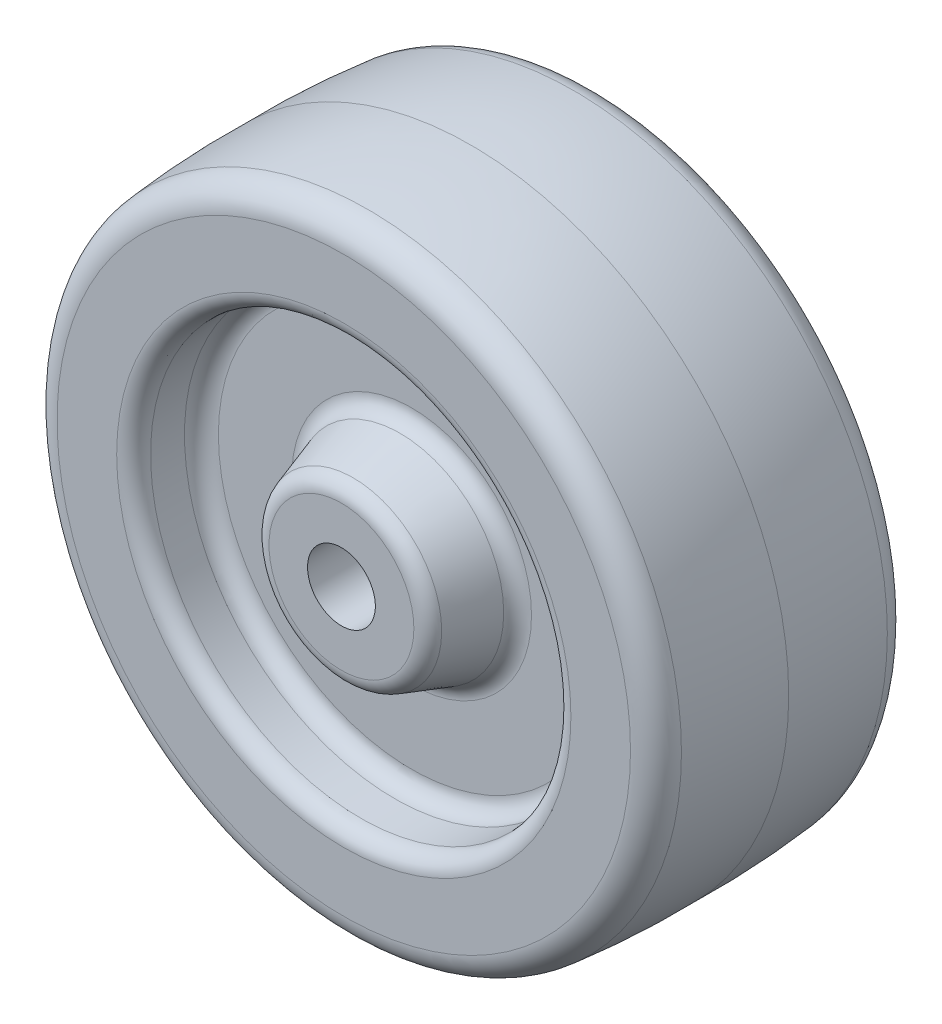
ISO-10303-21;
HEADER;
FILE_DESCRIPTION(('STEP AP214'),'2;1');
FILE_NAME('part.step','',(''),(''),'','','');
FILE_SCHEMA(('AUTOMOTIVE_DESIGN { 1 0 10303 214 1 1 1 1 }'));
ENDSEC;
DATA;
#1=APPLICATION_CONTEXT('core data for automotive mechanical design processes');
#2=APPLICATION_PROTOCOL_DEFINITION('international standard','automotive_design',2000,#1);
#3=PRODUCT_CONTEXT('',#1,'mechanical');
#4=PRODUCT('Part','Part','',(#3));
#5=PRODUCT_RELATED_PRODUCT_CATEGORY('part','',(#4));
#6=PRODUCT_DEFINITION_FORMATION('','',#4);
#7=PRODUCT_DEFINITION_CONTEXT('part definition',#1,'design');
#8=PRODUCT_DEFINITION('design','',#6,#7);
#9=PRODUCT_DEFINITION_SHAPE('','',#8);
#10=(LENGTH_UNIT() NAMED_UNIT(*) SI_UNIT(.MILLI.,.METRE.));
#11=(NAMED_UNIT(*) PLANE_ANGLE_UNIT() SI_UNIT($,.RADIAN.));
#12=(NAMED_UNIT(*) SI_UNIT($,.STERADIAN.) SOLID_ANGLE_UNIT());
#13=UNCERTAINTY_MEASURE_WITH_UNIT(LENGTH_MEASURE(1.E-05),#10,'distance_accuracy_value','');
#14=(GEOMETRIC_REPRESENTATION_CONTEXT(3) GLOBAL_UNCERTAINTY_ASSIGNED_CONTEXT((#13)) GLOBAL_UNIT_ASSIGNED_CONTEXT((#10,
#11,#12)) REPRESENTATION_CONTEXT('',''));
#15=CARTESIAN_POINT('',(0.,0.,0.));
#16=DIRECTION('',(0.,0.,1.));
#17=DIRECTION('',(1.,0.,0.));
#18=AXIS2_PLACEMENT_3D('',#15,#16,#17);
#19=CARTESIAN_POINT('',(0.,-51.2996908813686,-15.2776519462243));
#20=DIRECTION('',(0.,0.,-1.));
#21=DIRECTION('',(-1.,0.,0.));
#22=AXIS2_PLACEMENT_3D('',#19,#20,#21);
#23=PLANE('',#22);
#24=CARTESIAN_POINT('',(0.,-42.7510363583504,-15.2776519462243));
#25=DIRECTION('',(0.,0.,-1.));
#26=DIRECTION('',(-1.,0.,0.));
#27=AXIS2_PLACEMENT_3D('',#24,#25,#26);
#28=CIRCLE('',#27,4.);
#29=CARTESIAN_POINT('',(-4.,-42.7510363583504,-15.2776519462243));
#30=VERTEX_POINT('',#29);
#31=EDGE_CURVE('E129',#30,#30,#28,.T.);
#32=ORIENTED_EDGE('',*,*,#31,.F.);
#33=EDGE_LOOP('',(#32));
#34=FACE_BOUND('',#33,.T.);
#35=CARTESIAN_POINT('',(0.,-42.7510363583504,-15.2776519462243));
#36=DIRECTION('',(0.,0.,1.));
#37=DIRECTION('',(1.,0.,0.));
#38=AXIS2_PLACEMENT_3D('',#35,#36,#37);
#39=CIRCLE('',#38,8.54865452301821);
#40=CARTESIAN_POINT('',(8.54865452301821,-42.7510363583504,-15.2776519462243));
#41=VERTEX_POINT('',#40);
#42=EDGE_CURVE('E124',#41,#41,#39,.T.);
#43=ORIENTED_EDGE('',*,*,#42,.F.);
#44=EDGE_LOOP('',(#43));
#45=FACE_BOUND('',#44,.T.);
#46=ADVANCED_FACE('F36',(#34,#45),#23,.T.);
#47=CARTESIAN_POINT('',(0.,-51.2996908813686,15.2776519462243));
#48=DIRECTION('',(0.,0.,1.));
#49=DIRECTION('',(1.,0.,0.));
#50=AXIS2_PLACEMENT_3D('',#47,#48,#49);
#51=PLANE('',#50);
#52=CARTESIAN_POINT('',(0.,-42.7510363583504,15.2776519462243));
#53=DIRECTION('',(0.,0.,-1.));
#54=DIRECTION('',(-1.,0.,0.));
#55=AXIS2_PLACEMENT_3D('',#52,#53,#54);
#56=CIRCLE('',#55,4.);
#57=CARTESIAN_POINT('',(-4.,-42.7510363583504,15.2776519462243));
#58=VERTEX_POINT('',#57);
#59=EDGE_CURVE('E128',#58,#58,#56,.T.);
#60=ORIENTED_EDGE('',*,*,#59,.T.);
#61=EDGE_LOOP('',(#60));
#62=FACE_BOUND('',#61,.T.);
#63=CARTESIAN_POINT('',(0.,-42.7510363583504,15.2776519462243));
#64=DIRECTION('',(0.,0.,1.));
#65=DIRECTION('',(1.,0.,0.));
#66=AXIS2_PLACEMENT_3D('',#63,#64,#65);
#67=CIRCLE('',#66,8.54865452301821);
#68=CARTESIAN_POINT('',(8.54865452301821,-42.7510363583504,15.2776519462243));
#69=VERTEX_POINT('',#68);
#70=EDGE_CURVE('E10',#69,#69,#67,.T.);
#71=ORIENTED_EDGE('',*,*,#70,.T.);
#72=EDGE_LOOP('',(#71));
#73=FACE_BOUND('',#72,.T.);
#74=ADVANCED_FACE('F136',(#62,#73),#51,.T.);
#75=CARTESIAN_POINT('',(0.,-42.7510363583504,13.2776519462243));
#76=DIRECTION('',(0.,0.,1.));
#77=DIRECTION('',(1.,0.,0.));
#78=AXIS2_PLACEMENT_3D('',#75,#76,#77);
#79=TOROIDAL_SURFACE('',#78,8.54865452301822,2.);
#80=CARTESIAN_POINT('',(0.,-42.7510363583504,13.8978521168887));
#81=DIRECTION('',(0.,0.,1.));
#82=DIRECTION('',(1.,0.,0.));
#83=AXIS2_PLACEMENT_3D('',#80,#81,#82);
#84=CIRCLE('',#83,10.4500623562586);
#85=CARTESIAN_POINT('',(10.4500623562586,-42.7510363583504,13.8978521168887));
#86=VERTEX_POINT('',#85);
#87=EDGE_CURVE('E43',#86,#86,#84,.T.);
#88=ORIENTED_EDGE('',*,*,#87,.T.);
#89=EDGE_LOOP('',(#88));
#90=FACE_BOUND('',#89,.T.);
#91=ORIENTED_EDGE('',*,*,#70,.F.);
#92=EDGE_LOOP('',(#91));
#93=FACE_BOUND('',#92,.T.);
#94=ADVANCED_FACE('F259',(#90,#93),#79,.T.);
#95=CARTESIAN_POINT('',(0.,-42.7510363583504,13.8978521168887));
#96=DIRECTION('',(0.,0.,-1.));
#97=DIRECTION('',(-1.,0.,0.));
#98=AXIS2_PLACEMENT_3D('',#95,#96,#97);
#99=CONICAL_SURFACE('',#98,10.4500623562586,0.315298305609704);
#100=CARTESIAN_POINT('',(0.,-42.7510363583504,8.37979982933559));
#101=DIRECTION('',(0.,0.,1.));
#102=DIRECTION('',(1.,0.,0.));
#103=AXIS2_PLACEMENT_3D('',#100,#101,#102);
#104=CIRCLE('',#103,12.2499376437414);
#105=CARTESIAN_POINT('',(12.2499376437414,-42.7510363583504,8.37979982933559));
#106=VERTEX_POINT('',#105);
#107=EDGE_CURVE('E49',#106,#106,#104,.T.);
#108=ORIENTED_EDGE('',*,*,#107,.T.);
#109=EDGE_LOOP('',(#108));
#110=FACE_BOUND('',#109,.T.);
#111=ORIENTED_EDGE('',*,*,#87,.F.);
#112=EDGE_LOOP('',(#111));
#113=FACE_BOUND('',#112,.T.);
#114=ADVANCED_FACE('F253',(#110,#113),#99,.T.);
#115=CARTESIAN_POINT('',(0.,-42.7510363583504,9.00000000000001));
#116=DIRECTION('',(0.,0.,1.));
#117=DIRECTION('',(1.,0.,0.));
#118=AXIS2_PLACEMENT_3D('',#115,#116,#117);
#119=TOROIDAL_SURFACE('',#118,14.1513454769818,2.);
#120=CARTESIAN_POINT('',(0.,-42.7510363583504,7.00000000000001));
#121=DIRECTION('',(0.,0.,1.));
#122=DIRECTION('',(1.,0.,0.));
#123=AXIS2_PLACEMENT_3D('',#120,#121,#122);
#124=CIRCLE('',#123,14.1513454769818);
#125=CARTESIAN_POINT('',(14.1513454769818,-42.7510363583504,7.00000000000001));
#126=VERTEX_POINT('',#125);
#127=EDGE_CURVE('E54',#126,#126,#124,.T.);
#128=ORIENTED_EDGE('',*,*,#127,.T.);
#129=EDGE_LOOP('',(#128));
#130=FACE_BOUND('',#129,.T.);
#131=ORIENTED_EDGE('',*,*,#107,.F.);
#132=EDGE_LOOP('',(#131));
#133=FACE_BOUND('',#132,.T.);
#134=ADVANCED_FACE('F247',(#130,#133),#119,.F.);
#135=CARTESIAN_POINT('',(0.,-65.5510363583504,7.00000000000001));
#136=DIRECTION('',(0.,0.,1.));
#137=DIRECTION('',(1.,0.,0.));
#138=AXIS2_PLACEMENT_3D('',#135,#136,#137);
#139=PLANE('',#138);
#140=CARTESIAN_POINT('',(0.,-42.7510363583504,7.));
#141=DIRECTION('',(0.,0.,1.));
#142=DIRECTION('',(1.,0.,0.));
#143=AXIS2_PLACEMENT_3D('',#140,#141,#142);
#144=CIRCLE('',#143,22.8);
#145=CARTESIAN_POINT('',(22.8,-42.7510363583504,7.));
#146=VERTEX_POINT('',#145);
#147=EDGE_CURVE('E60',#146,#146,#144,.T.);
#148=ORIENTED_EDGE('',*,*,#147,.T.);
#149=EDGE_LOOP('',(#148));
#150=FACE_BOUND('',#149,.T.);
#151=ORIENTED_EDGE('',*,*,#127,.F.);
#152=EDGE_LOOP('',(#151));
#153=FACE_BOUND('',#152,.T.);
#154=ADVANCED_FACE('F241',(#150,#153),#139,.T.);
#155=CARTESIAN_POINT('',(0.,-42.7510363583504,9.00000000000001));
#156=DIRECTION('',(0.,0.,1.));
#157=DIRECTION('',(1.,0.,0.));
#158=AXIS2_PLACEMENT_3D('',#155,#156,#157);
#159=TOROIDAL_SURFACE('',#158,22.8,2.);
#160=CARTESIAN_POINT('',(0.,-42.7510363583504,9.00000000000002));
#161=DIRECTION('',(0.,0.,1.));
#162=DIRECTION('',(1.,0.,0.));
#163=AXIS2_PLACEMENT_3D('',#160,#161,#162);
#164=CIRCLE('',#163,24.8);
#165=CARTESIAN_POINT('',(24.8,-42.7510363583504,9.00000000000002));
#166=VERTEX_POINT('',#165);
#167=EDGE_CURVE('E64',#166,#166,#164,.T.);
#168=ORIENTED_EDGE('',*,*,#167,.T.);
#169=EDGE_LOOP('',(#168));
#170=FACE_BOUND('',#169,.T.);
#171=ORIENTED_EDGE('',*,*,#147,.F.);
#172=EDGE_LOOP('',(#171));
#173=FACE_BOUND('',#172,.T.);
#174=ADVANCED_FACE('F235',(#170,#173),#159,.F.);
#175=CARTESIAN_POINT('',(0.,-42.7510363583504,15.2776519462243));
#176=DIRECTION('',(0.,0.,1.));
#177=DIRECTION('',(1.,0.,0.));
#178=AXIS2_PLACEMENT_3D('',#175,#176,#177);
#179=CYLINDRICAL_SURFACE('',#178,24.8);
#180=CARTESIAN_POINT('',(0.,-42.7510363583504,13.));
#181=DIRECTION('',(0.,0.,1.));
#182=DIRECTION('',(1.,0.,0.));
#183=AXIS2_PLACEMENT_3D('',#180,#181,#182);
#184=CIRCLE('',#183,24.8);
#185=CARTESIAN_POINT('',(24.8,-42.7510363583504,13.));
#186=VERTEX_POINT('',#185);
#187=EDGE_CURVE('E68',#186,#186,#184,.T.);
#188=ORIENTED_EDGE('',*,*,#187,.T.);
#189=EDGE_LOOP('',(#188));
#190=FACE_BOUND('',#189,.T.);
#191=ORIENTED_EDGE('',*,*,#167,.F.);
#192=EDGE_LOOP('',(#191));
#193=FACE_BOUND('',#192,.T.);
#194=ADVANCED_FACE('F229',(#190,#193),#179,.F.);
#195=CARTESIAN_POINT('',(0.,-42.7510363583504,13.));
#196=DIRECTION('',(0.,0.,1.));
#197=DIRECTION('',(1.,0.,0.));
#198=AXIS2_PLACEMENT_3D('',#195,#196,#197);
#199=TOROIDAL_SURFACE('',#198,26.8,2.);
#200=CARTESIAN_POINT('',(0.,-42.7510363583504,15.));
#201=DIRECTION('',(0.,0.,1.));
#202=DIRECTION('',(1.,0.,0.));
#203=AXIS2_PLACEMENT_3D('',#200,#201,#202);
#204=CIRCLE('',#203,26.8);
#205=CARTESIAN_POINT('',(26.8,-42.7510363583504,15.));
#206=VERTEX_POINT('',#205);
#207=EDGE_CURVE('E72',#206,#206,#204,.T.);
#208=ORIENTED_EDGE('',*,*,#207,.T.);
#209=EDGE_LOOP('',(#208));
#210=FACE_BOUND('',#209,.T.);
#211=ORIENTED_EDGE('',*,*,#187,.F.);
#212=EDGE_LOOP('',(#211));
#213=FACE_BOUND('',#212,.T.);
#214=ADVANCED_FACE('F223',(#210,#213),#199,.T.);
#215=CARTESIAN_POINT('',(0.,-76.5844146627606,15.));
#216=DIRECTION('',(0.,0.,1.));
#217=DIRECTION('',(1.,0.,0.));
#218=AXIS2_PLACEMENT_3D('',#215,#216,#217);
#219=PLANE('',#218);
#220=CARTESIAN_POINT('',(0.,-42.7510363583504,15.));
#221=DIRECTION('',(0.,0.,1.));
#222=DIRECTION('',(1.,0.,0.));
#223=AXIS2_PLACEMENT_3D('',#220,#221,#222);
#224=CIRCLE('',#223,33.8333783044102);
#225=CARTESIAN_POINT('',(33.8333783044102,-42.7510363583504,15.));
#226=VERTEX_POINT('',#225);
#227=EDGE_CURVE('E76',#226,#226,#224,.T.);
#228=ORIENTED_EDGE('',*,*,#227,.T.);
#229=EDGE_LOOP('',(#228));
#230=FACE_BOUND('',#229,.T.);
#231=ORIENTED_EDGE('',*,*,#207,.F.);
#232=EDGE_LOOP('',(#231));
#233=FACE_BOUND('',#232,.T.);
#234=ADVANCED_FACE('F217',(#230,#233),#219,.T.);
#235=CARTESIAN_POINT('',(0.,-42.7510363583504,11.825));
#236=DIRECTION('',(0.,0.,1.));
#237=DIRECTION('',(1.,0.,0.));
#238=AXIS2_PLACEMENT_3D('',#235,#236,#237);
#239=TOROIDAL_SURFACE('',#238,33.8333783044102,3.175);
#240=CARTESIAN_POINT('',(0.,-42.7510363583504,12.1470776057875));
#241=DIRECTION('',(0.,0.,1.));
#242=DIRECTION('',(1.,0.,0.));
#243=AXIS2_PLACEMENT_3D('',#240,#241,#242);
#244=CIRCLE('',#243,36.992);
#245=CARTESIAN_POINT('',(36.992,-42.7510363583504,12.1470776057875));
#246=VERTEX_POINT('',#245);
#247=EDGE_CURVE('E80',#246,#246,#244,.T.);
#248=ORIENTED_EDGE('',*,*,#247,.T.);
#249=EDGE_LOOP('',(#248));
#250=FACE_BOUND('',#249,.T.);
#251=ORIENTED_EDGE('',*,*,#227,.F.);
#252=EDGE_LOOP('',(#251));
#253=FACE_BOUND('',#252,.T.);
#254=ADVANCED_FACE('F211',(#250,#253),#239,.T.);
#255=CARTESIAN_POINT('',(0.,-42.7510363583504,1.83254410945013));
#256=DIRECTION('',(0.,0.,1.));
#257=DIRECTION('',(1.,0.,0.));
#258=AXIS2_PLACEMENT_3D('',#255,#256,#257);
#259=DEGENERATE_TOROIDAL_SURFACE('',#258,64.16284186416,101.67935696989,.F.);
#260=CARTESIAN_POINT('',(0.,-42.7510363583504,0.));
#261=DIRECTION('',(0.,0.,1.));
#262=DIRECTION('',(1.,0.,0.));
#263=AXIS2_PLACEMENT_3D('',#260,#261,#262);
#264=CIRCLE('',#263,37.5);
#265=CARTESIAN_POINT('',(37.5,-42.7510363583504,0.));
#266=VERTEX_POINT('',#265);
#267=EDGE_CURVE('E84',#266,#266,#264,.T.);
#268=ORIENTED_EDGE('',*,*,#267,.T.);
#269=EDGE_LOOP('',(#268));
#270=FACE_BOUND('',#269,.T.);
#271=ORIENTED_EDGE('',*,*,#247,.F.);
#272=EDGE_LOOP('',(#271));
#273=FACE_BOUND('',#272,.T.);
#274=ADVANCED_FACE('F205',(#270,#273),#259,.F.);
#275=CARTESIAN_POINT('',(0.,-42.7510363583504,-1.83254410945012));
#276=DIRECTION('',(0.,0.,1.));
#277=DIRECTION('',(1.,0.,0.));
#278=AXIS2_PLACEMENT_3D('',#275,#276,#277);
#279=DEGENERATE_TOROIDAL_SURFACE('',#278,64.16284186416,101.67935696989,.F.);
#280=CARTESIAN_POINT('',(0.,-42.7510363583504,-12.1470776057875));
#281=DIRECTION('',(0.,0.,1.));
#282=DIRECTION('',(1.,0.,0.));
#283=AXIS2_PLACEMENT_3D('',#280,#281,#282);
#284=CIRCLE('',#283,36.992);
#285=CARTESIAN_POINT('',(36.992,-42.7510363583504,-12.1470776057875));
#286=VERTEX_POINT('',#285);
#287=EDGE_CURVE('E88',#286,#286,#284,.T.);
#288=ORIENTED_EDGE('',*,*,#287,.T.);
#289=EDGE_LOOP('',(#288));
#290=FACE_BOUND('',#289,.T.);
#291=ORIENTED_EDGE('',*,*,#267,.F.);
#292=EDGE_LOOP('',(#291));
#293=FACE_BOUND('',#292,.T.);
#294=ADVANCED_FACE('F199',(#290,#293),#279,.F.);
#295=CARTESIAN_POINT('',(0.,-42.7510363583504,-11.825));
#296=DIRECTION('',(0.,0.,1.));
#297=DIRECTION('',(1.,0.,0.));
#298=AXIS2_PLACEMENT_3D('',#295,#296,#297);
#299=TOROIDAL_SURFACE('',#298,33.8333783044102,3.175);
#300=CARTESIAN_POINT('',(0.,-42.7510363583504,-15.));
#301=DIRECTION('',(0.,0.,1.));
#302=DIRECTION('',(1.,0.,0.));
#303=AXIS2_PLACEMENT_3D('',#300,#301,#302);
#304=CIRCLE('',#303,33.8333783044102);
#305=CARTESIAN_POINT('',(33.8333783044102,-42.7510363583504,-15.));
#306=VERTEX_POINT('',#305);
#307=EDGE_CURVE('E92',#306,#306,#304,.T.);
#308=ORIENTED_EDGE('',*,*,#307,.T.);
#309=EDGE_LOOP('',(#308));
#310=FACE_BOUND('',#309,.T.);
#311=ORIENTED_EDGE('',*,*,#287,.F.);
#312=EDGE_LOOP('',(#311));
#313=FACE_BOUND('',#312,.T.);
#314=ADVANCED_FACE('F193',(#310,#313),#299,.T.);
#315=CARTESIAN_POINT('',(0.,-76.5844146627606,-15.));
#316=DIRECTION('',(0.,0.,-1.));
#317=DIRECTION('',(-1.,0.,0.));
#318=AXIS2_PLACEMENT_3D('',#315,#316,#317);
#319=PLANE('',#318);
#320=CARTESIAN_POINT('',(0.,-42.7510363583504,-15.));
#321=DIRECTION('',(0.,0.,1.));
#322=DIRECTION('',(1.,0.,0.));
#323=AXIS2_PLACEMENT_3D('',#320,#321,#322);
#324=CIRCLE('',#323,26.8);
#325=CARTESIAN_POINT('',(26.8,-42.7510363583504,-15.));
#326=VERTEX_POINT('',#325);
#327=EDGE_CURVE('E96',#326,#326,#324,.T.);
#328=ORIENTED_EDGE('',*,*,#327,.T.);
#329=EDGE_LOOP('',(#328));
#330=FACE_BOUND('',#329,.T.);
#331=ORIENTED_EDGE('',*,*,#307,.F.);
#332=EDGE_LOOP('',(#331));
#333=FACE_BOUND('',#332,.T.);
#334=ADVANCED_FACE('F187',(#330,#333),#319,.T.);
#335=CARTESIAN_POINT('',(0.,-42.7510363583504,-13.));
#336=DIRECTION('',(0.,0.,1.));
#337=DIRECTION('',(1.,0.,0.));
#338=AXIS2_PLACEMENT_3D('',#335,#336,#337);
#339=TOROIDAL_SURFACE('',#338,26.8,2.);
#340=CARTESIAN_POINT('',(0.,-42.7510363583504,-13.));
#341=DIRECTION('',(0.,0.,1.));
#342=DIRECTION('',(1.,0.,0.));
#343=AXIS2_PLACEMENT_3D('',#340,#341,#342);
#344=CIRCLE('',#343,24.8);
#345=CARTESIAN_POINT('',(24.8,-42.7510363583504,-13.));
#346=VERTEX_POINT('',#345);
#347=EDGE_CURVE('E100',#346,#346,#344,.T.);
#348=ORIENTED_EDGE('',*,*,#347,.T.);
#349=EDGE_LOOP('',(#348));
#350=FACE_BOUND('',#349,.T.);
#351=ORIENTED_EDGE('',*,*,#327,.F.);
#352=EDGE_LOOP('',(#351));
#353=FACE_BOUND('',#352,.T.);
#354=ADVANCED_FACE('F181',(#350,#353),#339,.T.);
#355=CARTESIAN_POINT('',(0.,-42.7510363583504,15.2776519462243));
#356=DIRECTION('',(0.,0.,1.));
#357=DIRECTION('',(1.,0.,0.));
#358=AXIS2_PLACEMENT_3D('',#355,#356,#357);
#359=CYLINDRICAL_SURFACE('',#358,24.8);
#360=CARTESIAN_POINT('',(0.,-42.7510363583504,-9.00000000000002));
#361=DIRECTION('',(0.,0.,1.));
#362=DIRECTION('',(1.,0.,0.));
#363=AXIS2_PLACEMENT_3D('',#360,#361,#362);
#364=CIRCLE('',#363,24.8);
#365=CARTESIAN_POINT('',(24.8,-42.7510363583504,-9.00000000000002));
#366=VERTEX_POINT('',#365);
#367=EDGE_CURVE('E104',#366,#366,#364,.T.);
#368=ORIENTED_EDGE('',*,*,#367,.T.);
#369=EDGE_LOOP('',(#368));
#370=FACE_BOUND('',#369,.T.);
#371=ORIENTED_EDGE('',*,*,#347,.F.);
#372=EDGE_LOOP('',(#371));
#373=FACE_BOUND('',#372,.T.);
#374=ADVANCED_FACE('F175',(#370,#373),#359,.F.);
#375=CARTESIAN_POINT('',(0.,-42.7510363583504,-9.00000000000001));
#376=DIRECTION('',(0.,0.,1.));
#377=DIRECTION('',(1.,0.,0.));
#378=AXIS2_PLACEMENT_3D('',#375,#376,#377);
#379=TOROIDAL_SURFACE('',#378,22.8,2.);
#380=CARTESIAN_POINT('',(0.,-42.7510363583504,-7.));
#381=DIRECTION('',(0.,0.,1.));
#382=DIRECTION('',(1.,0.,0.));
#383=AXIS2_PLACEMENT_3D('',#380,#381,#382);
#384=CIRCLE('',#383,22.8);
#385=CARTESIAN_POINT('',(22.8,-42.7510363583504,-7.));
#386=VERTEX_POINT('',#385);
#387=EDGE_CURVE('E108',#386,#386,#384,.T.);
#388=ORIENTED_EDGE('',*,*,#387,.T.);
#389=EDGE_LOOP('',(#388));
#390=FACE_BOUND('',#389,.T.);
#391=ORIENTED_EDGE('',*,*,#367,.F.);
#392=EDGE_LOOP('',(#391));
#393=FACE_BOUND('',#392,.T.);
#394=ADVANCED_FACE('F169',(#390,#393),#379,.F.);
#395=CARTESIAN_POINT('',(0.,-65.5510363583504,-7.));
#396=DIRECTION('',(0.,0.,-1.));
#397=DIRECTION('',(-1.,0.,0.));
#398=AXIS2_PLACEMENT_3D('',#395,#396,#397);
#399=PLANE('',#398);
#400=CARTESIAN_POINT('',(0.,-42.7510363583504,-7.00000000000001));
#401=DIRECTION('',(0.,0.,1.));
#402=DIRECTION('',(1.,0.,0.));
#403=AXIS2_PLACEMENT_3D('',#400,#401,#402);
#404=CIRCLE('',#403,14.1513454769818);
#405=CARTESIAN_POINT('',(14.1513454769818,-42.7510363583504,-7.00000000000001));
#406=VERTEX_POINT('',#405);
#407=EDGE_CURVE('E112',#406,#406,#404,.T.);
#408=ORIENTED_EDGE('',*,*,#407,.T.);
#409=EDGE_LOOP('',(#408));
#410=FACE_BOUND('',#409,.T.);
#411=ORIENTED_EDGE('',*,*,#387,.F.);
#412=EDGE_LOOP('',(#411));
#413=FACE_BOUND('',#412,.T.);
#414=ADVANCED_FACE('F163',(#410,#413),#399,.T.);
#415=CARTESIAN_POINT('',(0.,-42.7510363583504,-9.00000000000001));
#416=DIRECTION('',(0.,0.,1.));
#417=DIRECTION('',(1.,0.,0.));
#418=AXIS2_PLACEMENT_3D('',#415,#416,#417);
#419=TOROIDAL_SURFACE('',#418,14.1513454769818,2.);
#420=CARTESIAN_POINT('',(0.,-42.7510363583504,-8.37979982933559));
#421=DIRECTION('',(0.,0.,1.));
#422=DIRECTION('',(1.,0.,0.));
#423=AXIS2_PLACEMENT_3D('',#420,#421,#422);
#424=CIRCLE('',#423,12.2499376437414);
#425=CARTESIAN_POINT('',(12.2499376437414,-42.7510363583504,-8.37979982933559));
#426=VERTEX_POINT('',#425);
#427=EDGE_CURVE('E116',#426,#426,#424,.T.);
#428=ORIENTED_EDGE('',*,*,#427,.T.);
#429=EDGE_LOOP('',(#428));
#430=FACE_BOUND('',#429,.T.);
#431=ORIENTED_EDGE('',*,*,#407,.F.);
#432=EDGE_LOOP('',(#431));
#433=FACE_BOUND('',#432,.T.);
#434=ADVANCED_FACE('F157',(#430,#433),#419,.F.);
#435=CARTESIAN_POINT('',(0.,-42.7510363583504,-8.37979982933559));
#436=DIRECTION('',(0.,0.,1.));
#437=DIRECTION('',(1.,0.,0.));
#438=AXIS2_PLACEMENT_3D('',#435,#436,#437);
#439=CONICAL_SURFACE('',#438,12.2499376437414,0.315298305609703);
#440=CARTESIAN_POINT('',(0.,-42.7510363583504,-13.8978521168887));
#441=DIRECTION('',(0.,0.,1.));
#442=DIRECTION('',(1.,0.,0.));
#443=AXIS2_PLACEMENT_3D('',#440,#441,#442);
#444=CIRCLE('',#443,10.4500623562586);
#445=CARTESIAN_POINT('',(10.4500623562586,-42.7510363583504,-13.8978521168887));
#446=VERTEX_POINT('',#445);
#447=EDGE_CURVE('E120',#446,#446,#444,.T.);
#448=ORIENTED_EDGE('',*,*,#447,.T.);
#449=EDGE_LOOP('',(#448));
#450=FACE_BOUND('',#449,.T.);
#451=ORIENTED_EDGE('',*,*,#427,.F.);
#452=EDGE_LOOP('',(#451));
#453=FACE_BOUND('',#452,.T.);
#454=ADVANCED_FACE('F151',(#450,#453),#439,.T.);
#455=CARTESIAN_POINT('',(0.,-42.7510363583504,-13.2776519462243));
#456=DIRECTION('',(0.,0.,1.));
#457=DIRECTION('',(1.,0.,0.));
#458=AXIS2_PLACEMENT_3D('',#455,#456,#457);
#459=TOROIDAL_SURFACE('',#458,8.54865452301822,2.);
#460=ORIENTED_EDGE('',*,*,#42,.T.);
#461=EDGE_LOOP('',(#460));
#462=FACE_BOUND('',#461,.T.);
#463=ORIENTED_EDGE('',*,*,#447,.F.);
#464=EDGE_LOOP('',(#463));
#465=FACE_BOUND('',#464,.T.);
#466=ADVANCED_FACE('F141',(#462,#465),#459,.T.);
#467=CARTESIAN_POINT('',(0.,-42.7510363583504,15.2776519462243));
#468=DIRECTION('',(0.,0.,-1.));
#469=DIRECTION('',(-1.,0.,0.));
#470=AXIS2_PLACEMENT_3D('',#467,#468,#469);
#471=CYLINDRICAL_SURFACE('',#470,4.);
#472=ORIENTED_EDGE('',*,*,#59,.F.);
#473=EDGE_LOOP('',(#472));
#474=FACE_BOUND('',#473,.T.);
#475=ORIENTED_EDGE('',*,*,#31,.T.);
#476=EDGE_LOOP('',(#475));
#477=FACE_BOUND('',#476,.T.);
#478=ADVANCED_FACE('F138',(#474,#477),#471,.F.);
#479=CLOSED_SHELL('',(#46,#74,#94,#114,#134,#154,#174,#194,#214,#234,#254,#274,#294,#314,#334,
#354,#374,#394,#414,#434,#454,#466,#478));
#480=MANIFOLD_SOLID_BREP('B2',#479);
#481=ADVANCED_BREP_SHAPE_REPRESENTATION('',(#18,#480),#14);
#482=SHAPE_DEFINITION_REPRESENTATION(#9,#481);
ENDSEC;
END-ISO-10303-21;
